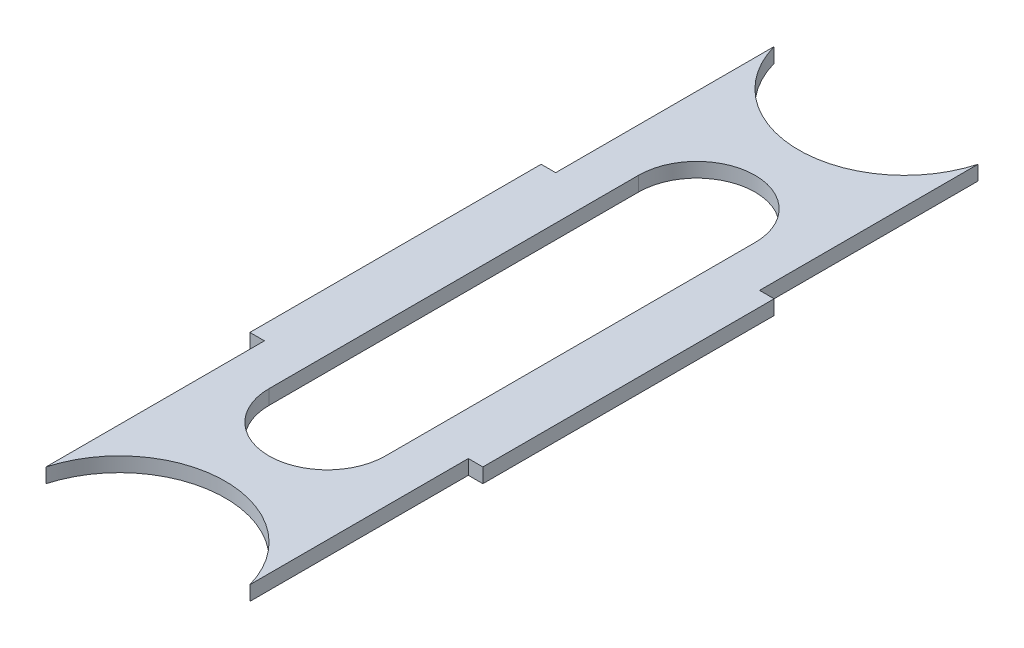
ISO-10303-21;
HEADER;
FILE_DESCRIPTION(('STEP AP214'),'2;1');
FILE_NAME('part.step','',(''),(''),'','','');
FILE_SCHEMA(('AUTOMOTIVE_DESIGN { 1 0 10303 214 1 1 1 1 }'));
ENDSEC;
DATA;
#1=APPLICATION_CONTEXT('core data for automotive mechanical design processes');
#2=APPLICATION_PROTOCOL_DEFINITION('international standard','automotive_design',2000,#1);
#3=PRODUCT_CONTEXT('',#1,'mechanical');
#4=PRODUCT('Part','Part','',(#3));
#5=PRODUCT_RELATED_PRODUCT_CATEGORY('part','',(#4));
#6=PRODUCT_DEFINITION_FORMATION('','',#4);
#7=PRODUCT_DEFINITION_CONTEXT('part definition',#1,'design');
#8=PRODUCT_DEFINITION('design','',#6,#7);
#9=PRODUCT_DEFINITION_SHAPE('','',#8);
#10=(LENGTH_UNIT() NAMED_UNIT(*) SI_UNIT(.MILLI.,.METRE.));
#11=(NAMED_UNIT(*) PLANE_ANGLE_UNIT() SI_UNIT($,.RADIAN.));
#12=(NAMED_UNIT(*) SI_UNIT($,.STERADIAN.) SOLID_ANGLE_UNIT());
#13=UNCERTAINTY_MEASURE_WITH_UNIT(LENGTH_MEASURE(1.E-05),#10,'distance_accuracy_value','');
#14=(GEOMETRIC_REPRESENTATION_CONTEXT(3) GLOBAL_UNCERTAINTY_ASSIGNED_CONTEXT((#13)) GLOBAL_UNIT_ASSIGNED_CONTEXT((#10,
#11,#12)) REPRESENTATION_CONTEXT('',''));
#15=CARTESIAN_POINT('',(0.,0.,0.));
#16=DIRECTION('',(0.,0.,1.));
#17=DIRECTION('',(1.,0.,0.));
#18=AXIS2_PLACEMENT_3D('',#15,#16,#17);
#19=CARTESIAN_POINT('',(0.,1.5875,-42.799));
#20=DIRECTION('',(0.,-1.,0.));
#21=DIRECTION('',(0.,0.,-1.));
#22=AXIS2_PLACEMENT_3D('',#19,#20,#21);
#23=CYLINDRICAL_SURFACE('',#22,11.5398911823292);
#24=CARTESIAN_POINT('',(0.,0.,-42.799));
#25=DIRECTION('',(0.,1.,0.));
#26=DIRECTION('',(0.,0.,1.));
#27=AXIS2_PLACEMENT_3D('',#24,#25,#26);
#28=CIRCLE('',#27,11.5398911823292);
#29=CARTESIAN_POINT('',(-11.1125,0.,-39.6875));
#30=VERTEX_POINT('',#29);
#31=CARTESIAN_POINT('',(11.1125,0.,-39.6875));
#32=VERTEX_POINT('',#31);
#33=EDGE_CURVE('E238',#30,#32,#28,.T.);
#34=ORIENTED_EDGE('',*,*,#33,.F.);
#35=DIRECTION('',(0.,-1.,0.));
#36=VECTOR('',#35,1.);
#37=CARTESIAN_POINT('',(-11.1125,1.5875,-39.6875));
#38=LINE('',#37,#36);
#39=CARTESIAN_POINT('',(-11.1125,1.5875,-39.6875));
#40=VERTEX_POINT('',#39);
#41=EDGE_CURVE('E11',#40,#30,#38,.T.);
#42=ORIENTED_EDGE('',*,*,#41,.F.);
#43=CARTESIAN_POINT('',(0.,1.5875,-42.799));
#44=DIRECTION('',(0.,1.,0.));
#45=DIRECTION('',(0.,0.,1.));
#46=AXIS2_PLACEMENT_3D('',#43,#44,#45);
#47=CIRCLE('',#46,11.5398911823292);
#48=CARTESIAN_POINT('',(11.1125,1.5875,-39.6875));
#49=VERTEX_POINT('',#48);
#50=EDGE_CURVE('E271',#40,#49,#47,.T.);
#51=ORIENTED_EDGE('',*,*,#50,.T.);
#52=DIRECTION('',(0.,-1.,0.));
#53=VECTOR('',#52,1.);
#54=CARTESIAN_POINT('',(11.1125,1.5875,-39.6875));
#55=LINE('',#54,#53);
#56=EDGE_CURVE('E58',#49,#32,#55,.T.);
#57=ORIENTED_EDGE('',*,*,#56,.T.);
#58=EDGE_LOOP('',(#34,#42,#51,#57));
#59=FACE_BOUND('',#58,.T.);
#60=ADVANCED_FACE('F39',(#59),#23,.F.);
#61=CARTESIAN_POINT('',(-11.1125,1.5875,0.));
#62=DIRECTION('',(1.,0.,0.));
#63=DIRECTION('',(0.,0.,-1.));
#64=AXIS2_PLACEMENT_3D('',#61,#62,#63);
#65=PLANE('',#64);
#66=DIRECTION('',(0.,0.,1.));
#67=VECTOR('',#66,1.);
#68=CARTESIAN_POINT('',(-11.1125,0.,0.));
#69=LINE('',#68,#67);
#70=CARTESIAN_POINT('',(-11.1125,0.,-15.875));
#71=VERTEX_POINT('',#70);
#72=EDGE_CURVE('E235',#30,#71,#69,.T.);
#73=ORIENTED_EDGE('',*,*,#72,.T.);
#74=DIRECTION('',(0.,-1.,0.));
#75=VECTOR('',#74,1.);
#76=CARTESIAN_POINT('',(-11.1125,1.5875,-15.875));
#77=LINE('',#76,#75);
#78=CARTESIAN_POINT('',(-11.1125,1.5875,-15.875));
#79=VERTEX_POINT('',#78);
#80=EDGE_CURVE('E49',#79,#71,#77,.T.);
#81=ORIENTED_EDGE('',*,*,#80,.F.);
#82=DIRECTION('',(0.,0.,1.));
#83=VECTOR('',#82,1.);
#84=CARTESIAN_POINT('',(-11.1125,1.5875,0.));
#85=LINE('',#84,#83);
#86=EDGE_CURVE('E269',#40,#79,#85,.T.);
#87=ORIENTED_EDGE('',*,*,#86,.F.);
#88=ORIENTED_EDGE('',*,*,#41,.T.);
#89=EDGE_LOOP('',(#73,#81,#87,#88));
#90=FACE_BOUND('',#89,.T.);
#91=ADVANCED_FACE('F305',(#90),#65,.F.);
#92=CARTESIAN_POINT('',(0.,1.5875,-15.875));
#93=DIRECTION('',(0.,0.,-1.));
#94=DIRECTION('',(-1.,0.,0.));
#95=AXIS2_PLACEMENT_3D('',#92,#93,#94);
#96=PLANE('',#95);
#97=DIRECTION('',(1.,0.,0.));
#98=VECTOR('',#97,1.);
#99=CARTESIAN_POINT('',(0.,0.,-15.875));
#100=LINE('',#99,#98);
#101=CARTESIAN_POINT('',(-12.7,0.,-15.875));
#102=VERTEX_POINT('',#101);
#103=EDGE_CURVE('E232',#102,#71,#100,.T.);
#104=ORIENTED_EDGE('',*,*,#103,.F.);
#105=DIRECTION('',(0.,-1.,0.));
#106=VECTOR('',#105,1.);
#107=CARTESIAN_POINT('',(-12.7,1.5875,-15.875));
#108=LINE('',#107,#106);
#109=CARTESIAN_POINT('',(-12.7,1.5875,-15.875));
#110=VERTEX_POINT('',#109);
#111=EDGE_CURVE('E198',#110,#102,#108,.T.);
#112=ORIENTED_EDGE('',*,*,#111,.F.);
#113=DIRECTION('',(1.,0.,0.));
#114=VECTOR('',#113,1.);
#115=CARTESIAN_POINT('',(0.,1.5875,-15.875));
#116=LINE('',#115,#114);
#117=EDGE_CURVE('E266',#110,#79,#116,.T.);
#118=ORIENTED_EDGE('',*,*,#117,.T.);
#119=ORIENTED_EDGE('',*,*,#80,.T.);
#120=EDGE_LOOP('',(#104,#112,#118,#119));
#121=FACE_BOUND('',#120,.T.);
#122=ADVANCED_FACE('F310',(#121),#96,.T.);
#123=CARTESIAN_POINT('',(-12.7,1.5875,0.));
#124=DIRECTION('',(-1.,0.,0.));
#125=DIRECTION('',(0.,0.,1.));
#126=AXIS2_PLACEMENT_3D('',#123,#124,#125);
#127=PLANE('',#126);
#128=DIRECTION('',(0.,0.,-1.));
#129=VECTOR('',#128,1.);
#130=CARTESIAN_POINT('',(-12.7,0.,0.));
#131=LINE('',#130,#129);
#132=CARTESIAN_POINT('',(-12.7,0.,15.875));
#133=VERTEX_POINT('',#132);
#134=EDGE_CURVE('E229',#133,#102,#131,.T.);
#135=ORIENTED_EDGE('',*,*,#134,.F.);
#136=DIRECTION('',(0.,-1.,0.));
#137=VECTOR('',#136,1.);
#138=CARTESIAN_POINT('',(-12.7,1.5875,15.875));
#139=LINE('',#138,#137);
#140=CARTESIAN_POINT('',(-12.7,1.5875,15.875));
#141=VERTEX_POINT('',#140);
#142=EDGE_CURVE('E196',#141,#133,#139,.T.);
#143=ORIENTED_EDGE('',*,*,#142,.F.);
#144=DIRECTION('',(0.,0.,-1.));
#145=VECTOR('',#144,1.);
#146=CARTESIAN_POINT('',(-12.7,1.5875,0.));
#147=LINE('',#146,#145);
#148=EDGE_CURVE('E263',#141,#110,#147,.T.);
#149=ORIENTED_EDGE('',*,*,#148,.T.);
#150=ORIENTED_EDGE('',*,*,#111,.T.);
#151=EDGE_LOOP('',(#135,#143,#149,#150));
#152=FACE_BOUND('',#151,.T.);
#153=ADVANCED_FACE('F422',(#152),#127,.T.);
#154=CARTESIAN_POINT('',(0.,1.5875,15.875));
#155=DIRECTION('',(0.,0.,1.));
#156=DIRECTION('',(1.,0.,0.));
#157=AXIS2_PLACEMENT_3D('',#154,#155,#156);
#158=PLANE('',#157);
#159=DIRECTION('',(-1.,0.,0.));
#160=VECTOR('',#159,1.);
#161=CARTESIAN_POINT('',(0.,0.,15.875));
#162=LINE('',#161,#160);
#163=CARTESIAN_POINT('',(-11.1125,0.,15.875));
#164=VERTEX_POINT('',#163);
#165=EDGE_CURVE('E226',#164,#133,#162,.T.);
#166=ORIENTED_EDGE('',*,*,#165,.F.);
#167=DIRECTION('',(0.,-1.,0.));
#168=VECTOR('',#167,1.);
#169=CARTESIAN_POINT('',(-11.1125,1.5875,15.875));
#170=LINE('',#169,#168);
#171=CARTESIAN_POINT('',(-11.1125,1.5875,15.875));
#172=VERTEX_POINT('',#171);
#173=EDGE_CURVE('E194',#172,#164,#170,.T.);
#174=ORIENTED_EDGE('',*,*,#173,.F.);
#175=DIRECTION('',(-1.,0.,0.));
#176=VECTOR('',#175,1.);
#177=CARTESIAN_POINT('',(0.,1.5875,15.875));
#178=LINE('',#177,#176);
#179=EDGE_CURVE('E260',#172,#141,#178,.T.);
#180=ORIENTED_EDGE('',*,*,#179,.T.);
#181=ORIENTED_EDGE('',*,*,#142,.T.);
#182=EDGE_LOOP('',(#166,#174,#180,#181));
#183=FACE_BOUND('',#182,.T.);
#184=ADVANCED_FACE('F413',(#183),#158,.T.);
#185=CARTESIAN_POINT('',(-11.1125,0.,39.6875));
#186=VERTEX_POINT('',#185);
#187=EDGE_CURVE('E225',#164,#186,#69,.T.);
#188=ORIENTED_EDGE('',*,*,#187,.T.);
#189=DIRECTION('',(0.,-1.,0.));
#190=VECTOR('',#189,1.);
#191=CARTESIAN_POINT('',(-11.1125,1.5875,39.6875));
#192=LINE('',#191,#190);
#193=CARTESIAN_POINT('',(-11.1125,1.5875,39.6875));
#194=VERTEX_POINT('',#193);
#195=EDGE_CURVE('E192',#194,#186,#192,.T.);
#196=ORIENTED_EDGE('',*,*,#195,.F.);
#197=EDGE_CURVE('E259',#172,#194,#85,.T.);
#198=ORIENTED_EDGE('',*,*,#197,.F.);
#199=ORIENTED_EDGE('',*,*,#173,.T.);
#200=EDGE_LOOP('',(#188,#196,#198,#199));
#201=FACE_BOUND('',#200,.T.);
#202=ADVANCED_FACE('F313',(#201),#65,.F.);
#203=CARTESIAN_POINT('',(0.,1.5875,42.799));
#204=DIRECTION('',(0.,-1.,0.));
#205=DIRECTION('',(0.,0.,-1.));
#206=AXIS2_PLACEMENT_3D('',#203,#204,#205);
#207=CYLINDRICAL_SURFACE('',#206,11.5398911823292);
#208=CARTESIAN_POINT('',(0.,0.,42.799));
#209=DIRECTION('',(0.,1.,0.));
#210=DIRECTION('',(0.,0.,1.));
#211=AXIS2_PLACEMENT_3D('',#208,#209,#210);
#212=CIRCLE('',#211,11.5398911823292);
#213=CARTESIAN_POINT('',(11.1125,0.,39.6875));
#214=VERTEX_POINT('',#213);
#215=EDGE_CURVE('E222',#214,#186,#212,.T.);
#216=ORIENTED_EDGE('',*,*,#215,.F.);
#217=DIRECTION('',(0.,-1.,0.));
#218=VECTOR('',#217,1.);
#219=CARTESIAN_POINT('',(11.1125,1.5875,39.6875));
#220=LINE('',#219,#218);
#221=CARTESIAN_POINT('',(11.1125,1.5875,39.6875));
#222=VERTEX_POINT('',#221);
#223=EDGE_CURVE('E190',#222,#214,#220,.T.);
#224=ORIENTED_EDGE('',*,*,#223,.F.);
#225=CARTESIAN_POINT('',(0.,1.5875,42.799));
#226=DIRECTION('',(0.,1.,0.));
#227=DIRECTION('',(0.,0.,1.));
#228=AXIS2_PLACEMENT_3D('',#225,#226,#227);
#229=CIRCLE('',#228,11.5398911823292);
#230=EDGE_CURVE('E256',#222,#194,#229,.T.);
#231=ORIENTED_EDGE('',*,*,#230,.T.);
#232=ORIENTED_EDGE('',*,*,#195,.T.);
#233=EDGE_LOOP('',(#216,#224,#231,#232));
#234=FACE_BOUND('',#233,.T.);
#235=ADVANCED_FACE('F302',(#234),#207,.F.);
#236=CARTESIAN_POINT('',(11.1125,1.5875,0.));
#237=DIRECTION('',(1.,0.,0.));
#238=DIRECTION('',(0.,0.,-1.));
#239=AXIS2_PLACEMENT_3D('',#236,#237,#238);
#240=PLANE('',#239);
#241=DIRECTION('',(0.,0.,1.));
#242=VECTOR('',#241,1.);
#243=CARTESIAN_POINT('',(11.1125,0.,0.));
#244=LINE('',#243,#242);
#245=CARTESIAN_POINT('',(11.1125,0.,15.875));
#246=VERTEX_POINT('',#245);
#247=EDGE_CURVE('E219',#246,#214,#244,.T.);
#248=ORIENTED_EDGE('',*,*,#247,.F.);
#249=DIRECTION('',(0.,-1.,0.));
#250=VECTOR('',#249,1.);
#251=CARTESIAN_POINT('',(11.1125,1.5875,15.875));
#252=LINE('',#251,#250);
#253=CARTESIAN_POINT('',(11.1125,1.5875,15.875));
#254=VERTEX_POINT('',#253);
#255=EDGE_CURVE('E184',#254,#246,#252,.T.);
#256=ORIENTED_EDGE('',*,*,#255,.F.);
#257=DIRECTION('',(0.,0.,1.));
#258=VECTOR('',#257,1.);
#259=CARTESIAN_POINT('',(11.1125,1.5875,0.));
#260=LINE('',#259,#258);
#261=EDGE_CURVE('E253',#254,#222,#260,.T.);
#262=ORIENTED_EDGE('',*,*,#261,.T.);
#263=ORIENTED_EDGE('',*,*,#223,.T.);
#264=EDGE_LOOP('',(#248,#256,#262,#263));
#265=FACE_BOUND('',#264,.T.);
#266=ADVANCED_FACE('F288',(#265),#240,.T.);
#267=CARTESIAN_POINT('',(0.,1.5875,15.875));
#268=DIRECTION('',(0.,0.,-1.));
#269=DIRECTION('',(-1.,0.,0.));
#270=AXIS2_PLACEMENT_3D('',#267,#268,#269);
#271=PLANE('',#270);
#272=DIRECTION('',(1.,0.,0.));
#273=VECTOR('',#272,1.);
#274=CARTESIAN_POINT('',(0.,0.,15.875));
#275=LINE('',#274,#273);
#276=CARTESIAN_POINT('',(12.7,0.,15.875));
#277=VERTEX_POINT('',#276);
#278=EDGE_CURVE('E216',#246,#277,#275,.T.);
#279=ORIENTED_EDGE('',*,*,#278,.T.);
#280=DIRECTION('',(0.,-1.,0.));
#281=VECTOR('',#280,1.);
#282=CARTESIAN_POINT('',(12.7,1.5875,15.875));
#283=LINE('',#282,#281);
#284=CARTESIAN_POINT('',(12.7,1.5875,15.875));
#285=VERTEX_POINT('',#284);
#286=EDGE_CURVE('E182',#285,#277,#283,.T.);
#287=ORIENTED_EDGE('',*,*,#286,.F.);
#288=DIRECTION('',(1.,0.,0.));
#289=VECTOR('',#288,1.);
#290=CARTESIAN_POINT('',(0.,1.5875,15.875));
#291=LINE('',#290,#289);
#292=EDGE_CURVE('E175',#254,#285,#291,.T.);
#293=ORIENTED_EDGE('',*,*,#292,.F.);
#294=ORIENTED_EDGE('',*,*,#255,.T.);
#295=EDGE_LOOP('',(#279,#287,#293,#294));
#296=FACE_BOUND('',#295,.T.);
#297=ADVANCED_FACE('F301',(#296),#271,.F.);
#298=CARTESIAN_POINT('',(12.7,1.5875,0.));
#299=DIRECTION('',(-1.,0.,0.));
#300=DIRECTION('',(0.,0.,1.));
#301=AXIS2_PLACEMENT_3D('',#298,#299,#300);
#302=PLANE('',#301);
#303=DIRECTION('',(0.,0.,-1.));
#304=VECTOR('',#303,1.);
#305=CARTESIAN_POINT('',(12.7,0.,0.));
#306=LINE('',#305,#304);
#307=CARTESIAN_POINT('',(12.7,0.,-15.875));
#308=VERTEX_POINT('',#307);
#309=EDGE_CURVE('E181',#277,#308,#306,.T.);
#310=ORIENTED_EDGE('',*,*,#309,.T.);
#311=DIRECTION('',(0.,-1.,0.));
#312=VECTOR('',#311,1.);
#313=CARTESIAN_POINT('',(12.7,1.5875,-15.875));
#314=LINE('',#313,#312);
#315=CARTESIAN_POINT('',(12.7,1.5875,-15.875));
#316=VERTEX_POINT('',#315);
#317=EDGE_CURVE('E163',#316,#308,#314,.T.);
#318=ORIENTED_EDGE('',*,*,#317,.F.);
#319=DIRECTION('',(0.,0.,-1.));
#320=VECTOR('',#319,1.);
#321=CARTESIAN_POINT('',(12.7,1.5875,0.));
#322=LINE('',#321,#320);
#323=EDGE_CURVE('E168',#285,#316,#322,.T.);
#324=ORIENTED_EDGE('',*,*,#323,.F.);
#325=ORIENTED_EDGE('',*,*,#286,.T.);
#326=EDGE_LOOP('',(#310,#318,#324,#325));
#327=FACE_BOUND('',#326,.T.);
#328=ADVANCED_FACE('F180',(#327),#302,.F.);
#329=CARTESIAN_POINT('',(0.,1.5875,-15.875));
#330=DIRECTION('',(0.,0.,1.));
#331=DIRECTION('',(1.,0.,0.));
#332=AXIS2_PLACEMENT_3D('',#329,#330,#331);
#333=PLANE('',#332);
#334=DIRECTION('',(-1.,0.,0.));
#335=VECTOR('',#334,1.);
#336=CARTESIAN_POINT('',(0.,0.,-15.875));
#337=LINE('',#336,#335);
#338=CARTESIAN_POINT('',(11.1125,0.,-15.875));
#339=VERTEX_POINT('',#338);
#340=EDGE_CURVE('E212',#308,#339,#337,.T.);
#341=ORIENTED_EDGE('',*,*,#340,.T.);
#342=DIRECTION('',(0.,-1.,0.));
#343=VECTOR('',#342,1.);
#344=CARTESIAN_POINT('',(11.1125,1.5875,-15.875));
#345=LINE('',#344,#343);
#346=CARTESIAN_POINT('',(11.1125,1.5875,-15.875));
#347=VERTEX_POINT('',#346);
#348=EDGE_CURVE('E108',#347,#339,#345,.T.);
#349=ORIENTED_EDGE('',*,*,#348,.F.);
#350=DIRECTION('',(-1.,0.,0.));
#351=VECTOR('',#350,1.);
#352=CARTESIAN_POINT('',(0.,1.5875,-15.875));
#353=LINE('',#352,#351);
#354=EDGE_CURVE('E159',#316,#347,#353,.T.);
#355=ORIENTED_EDGE('',*,*,#354,.F.);
#356=ORIENTED_EDGE('',*,*,#317,.T.);
#357=EDGE_LOOP('',(#341,#349,#355,#356));
#358=FACE_BOUND('',#357,.T.);
#359=ADVANCED_FACE('F161',(#358),#333,.F.);
#360=CARTESIAN_POINT('',(0.,1.5875,20.1466088176708));
#361=DIRECTION('',(0.,-1.,0.));
#362=DIRECTION('',(0.,0.,-1.));
#363=AXIS2_PLACEMENT_3D('',#360,#361,#362);
#364=CYLINDRICAL_SURFACE('',#363,6.35);
#365=CARTESIAN_POINT('',(0.,0.,20.1466088176708));
#366=DIRECTION('',(0.,1.,0.));
#367=DIRECTION('',(0.,0.,1.));
#368=AXIS2_PLACEMENT_3D('',#365,#366,#367);
#369=CIRCLE('',#368,6.35);
#370=CARTESIAN_POINT('',(-6.35,0.,20.1466088176708));
#371=VERTEX_POINT('',#370);
#372=CARTESIAN_POINT('',(6.35,0.,20.1466088176708));
#373=VERTEX_POINT('',#372);
#374=EDGE_CURVE('E249',#371,#373,#369,.T.);
#375=ORIENTED_EDGE('',*,*,#374,.F.);
#376=DIRECTION('',(0.,-1.,0.));
#377=VECTOR('',#376,1.);
#378=CARTESIAN_POINT('',(-6.35,1.5875,20.1466088176708));
#379=LINE('',#378,#377);
#380=CARTESIAN_POINT('',(-6.35,1.5875,20.1466088176708));
#381=VERTEX_POINT('',#380);
#382=EDGE_CURVE('E43',#381,#371,#379,.T.);
#383=ORIENTED_EDGE('',*,*,#382,.F.);
#384=CARTESIAN_POINT('',(0.,1.5875,20.1466088176708));
#385=DIRECTION('',(0.,1.,0.));
#386=DIRECTION('',(0.,0.,1.));
#387=AXIS2_PLACEMENT_3D('',#384,#385,#386);
#388=CIRCLE('',#387,6.35);
#389=CARTESIAN_POINT('',(6.35,1.5875,20.1466088176708));
#390=VERTEX_POINT('',#389);
#391=EDGE_CURVE('E279',#381,#390,#388,.T.);
#392=ORIENTED_EDGE('',*,*,#391,.T.);
#393=DIRECTION('',(0.,-1.,0.));
#394=VECTOR('',#393,1.);
#395=CARTESIAN_POINT('',(6.35,1.5875,20.1466088176708));
#396=LINE('',#395,#394);
#397=EDGE_CURVE('E201',#390,#373,#396,.T.);
#398=ORIENTED_EDGE('',*,*,#397,.T.);
#399=EDGE_LOOP('',(#375,#383,#392,#398));
#400=FACE_BOUND('',#399,.T.);
#401=ADVANCED_FACE('F41',(#400),#364,.F.);
#402=CARTESIAN_POINT('',(-6.35,1.5875,0.));
#403=DIRECTION('',(1.,0.,0.));
#404=DIRECTION('',(0.,0.,-1.));
#405=AXIS2_PLACEMENT_3D('',#402,#403,#404);
#406=PLANE('',#405);
#407=DIRECTION('',(0.,0.,1.));
#408=VECTOR('',#407,1.);
#409=CARTESIAN_POINT('',(-6.35,0.,0.));
#410=LINE('',#409,#408);
#411=CARTESIAN_POINT('',(-6.35,0.,-20.1466088176708));
#412=VERTEX_POINT('',#411);
#413=EDGE_CURVE('E246',#412,#371,#410,.T.);
#414=ORIENTED_EDGE('',*,*,#413,.F.);
#415=DIRECTION('',(0.,-1.,0.));
#416=VECTOR('',#415,1.);
#417=CARTESIAN_POINT('',(-6.35,1.5875,-20.1466088176708));
#418=LINE('',#417,#416);
#419=CARTESIAN_POINT('',(-6.35,1.5875,-20.1466088176708));
#420=VERTEX_POINT('',#419);
#421=EDGE_CURVE('E204',#420,#412,#418,.T.);
#422=ORIENTED_EDGE('',*,*,#421,.F.);
#423=DIRECTION('',(0.,0.,1.));
#424=VECTOR('',#423,1.);
#425=CARTESIAN_POINT('',(-6.35,1.5875,0.));
#426=LINE('',#425,#424);
#427=EDGE_CURVE('E277',#420,#381,#426,.T.);
#428=ORIENTED_EDGE('',*,*,#427,.T.);
#429=ORIENTED_EDGE('',*,*,#382,.T.);
#430=EDGE_LOOP('',(#414,#422,#428,#429));
#431=FACE_BOUND('',#430,.T.);
#432=ADVANCED_FACE('F318',(#431),#406,.T.);
#433=CARTESIAN_POINT('',(0.,1.5875,-20.1466088176708));
#434=DIRECTION('',(0.,-1.,0.));
#435=DIRECTION('',(0.,0.,-1.));
#436=AXIS2_PLACEMENT_3D('',#433,#434,#435);
#437=CYLINDRICAL_SURFACE('',#436,6.35);
#438=CARTESIAN_POINT('',(0.,0.,-20.1466088176708));
#439=DIRECTION('',(0.,1.,0.));
#440=DIRECTION('',(0.,0.,1.));
#441=AXIS2_PLACEMENT_3D('',#438,#439,#440);
#442=CIRCLE('',#441,6.35);
#443=CARTESIAN_POINT('',(6.35,0.,-20.1466088176708));
#444=VERTEX_POINT('',#443);
#445=EDGE_CURVE('E243',#444,#412,#442,.T.);
#446=ORIENTED_EDGE('',*,*,#445,.F.);
#447=DIRECTION('',(0.,-1.,0.));
#448=VECTOR('',#447,1.);
#449=CARTESIAN_POINT('',(6.35,1.5875,-20.1466088176708));
#450=LINE('',#449,#448);
#451=CARTESIAN_POINT('',(6.35,1.5875,-20.1466088176708));
#452=VERTEX_POINT('',#451);
#453=EDGE_CURVE('E203',#452,#444,#450,.T.);
#454=ORIENTED_EDGE('',*,*,#453,.F.);
#455=CARTESIAN_POINT('',(0.,1.5875,-20.1466088176708));
#456=DIRECTION('',(0.,1.,0.));
#457=DIRECTION('',(0.,0.,1.));
#458=AXIS2_PLACEMENT_3D('',#455,#456,#457);
#459=CIRCLE('',#458,6.35);
#460=EDGE_CURVE('E275',#452,#420,#459,.T.);
#461=ORIENTED_EDGE('',*,*,#460,.T.);
#462=ORIENTED_EDGE('',*,*,#421,.T.);
#463=EDGE_LOOP('',(#446,#454,#461,#462));
#464=FACE_BOUND('',#463,.T.);
#465=ADVANCED_FACE('F295',(#464),#437,.F.);
#466=CARTESIAN_POINT('',(6.35,1.5875,0.));
#467=DIRECTION('',(1.,0.,0.));
#468=DIRECTION('',(0.,0.,-1.));
#469=AXIS2_PLACEMENT_3D('',#466,#467,#468);
#470=PLANE('',#469);
#471=DIRECTION('',(0.,0.,1.));
#472=VECTOR('',#471,1.);
#473=CARTESIAN_POINT('',(6.35,0.,0.));
#474=LINE('',#473,#472);
#475=EDGE_CURVE('E240',#444,#373,#474,.T.);
#476=ORIENTED_EDGE('',*,*,#475,.T.);
#477=ORIENTED_EDGE('',*,*,#397,.F.);
#478=DIRECTION('',(0.,0.,1.));
#479=VECTOR('',#478,1.);
#480=CARTESIAN_POINT('',(6.35,1.5875,0.));
#481=LINE('',#480,#479);
#482=EDGE_CURVE('E273',#452,#390,#481,.T.);
#483=ORIENTED_EDGE('',*,*,#482,.F.);
#484=ORIENTED_EDGE('',*,*,#453,.T.);
#485=EDGE_LOOP('',(#476,#477,#483,#484));
#486=FACE_BOUND('',#485,.T.);
#487=ADVANCED_FACE('F286',(#486),#470,.F.);
#488=EDGE_CURVE('E214',#32,#339,#244,.T.);
#489=ORIENTED_EDGE('',*,*,#488,.F.);
#490=ORIENTED_EDGE('',*,*,#56,.F.);
#491=EDGE_CURVE('E167',#49,#347,#260,.T.);
#492=ORIENTED_EDGE('',*,*,#491,.T.);
#493=ORIENTED_EDGE('',*,*,#348,.T.);
#494=EDGE_LOOP('',(#489,#490,#492,#493));
#495=FACE_BOUND('',#494,.T.);
#496=ADVANCED_FACE('F284',(#495),#240,.T.);
#497=CARTESIAN_POINT('',(0.,1.5875,0.));
#498=DIRECTION('',(0.,1.,0.));
#499=DIRECTION('',(0.,0.,1.));
#500=AXIS2_PLACEMENT_3D('',#497,#498,#499);
#501=PLANE('',#500);
#502=ORIENTED_EDGE('',*,*,#391,.F.);
#503=ORIENTED_EDGE('',*,*,#427,.F.);
#504=ORIENTED_EDGE('',*,*,#460,.F.);
#505=ORIENTED_EDGE('',*,*,#482,.T.);
#506=EDGE_LOOP('',(#502,#503,#504,#505));
#507=FACE_BOUND('',#506,.T.);
#508=ORIENTED_EDGE('',*,*,#50,.F.);
#509=ORIENTED_EDGE('',*,*,#86,.T.);
#510=ORIENTED_EDGE('',*,*,#117,.F.);
#511=ORIENTED_EDGE('',*,*,#148,.F.);
#512=ORIENTED_EDGE('',*,*,#179,.F.);
#513=ORIENTED_EDGE('',*,*,#197,.T.);
#514=ORIENTED_EDGE('',*,*,#230,.F.);
#515=ORIENTED_EDGE('',*,*,#261,.F.);
#516=ORIENTED_EDGE('',*,*,#292,.T.);
#517=ORIENTED_EDGE('',*,*,#323,.T.);
#518=ORIENTED_EDGE('',*,*,#354,.T.);
#519=ORIENTED_EDGE('',*,*,#491,.F.);
#520=EDGE_LOOP('',(#508,#509,#510,#511,#512,#513,#514,#515,#516,#517,#518,#519));
#521=FACE_BOUND('',#520,.T.);
#522=ADVANCED_FACE('F172',(#507,#521),#501,.T.);
#523=CARTESIAN_POINT('',(0.,0.,0.));
#524=DIRECTION('',(0.,1.,0.));
#525=DIRECTION('',(0.,0.,1.));
#526=AXIS2_PLACEMENT_3D('',#523,#524,#525);
#527=PLANE('',#526);
#528=ORIENTED_EDGE('',*,*,#374,.T.);
#529=ORIENTED_EDGE('',*,*,#475,.F.);
#530=ORIENTED_EDGE('',*,*,#445,.T.);
#531=ORIENTED_EDGE('',*,*,#413,.T.);
#532=EDGE_LOOP('',(#528,#529,#530,#531));
#533=FACE_BOUND('',#532,.T.);
#534=ORIENTED_EDGE('',*,*,#33,.T.);
#535=ORIENTED_EDGE('',*,*,#488,.T.);
#536=ORIENTED_EDGE('',*,*,#340,.F.);
#537=ORIENTED_EDGE('',*,*,#309,.F.);
#538=ORIENTED_EDGE('',*,*,#278,.F.);
#539=ORIENTED_EDGE('',*,*,#247,.T.);
#540=ORIENTED_EDGE('',*,*,#215,.T.);
#541=ORIENTED_EDGE('',*,*,#187,.F.);
#542=ORIENTED_EDGE('',*,*,#165,.T.);
#543=ORIENTED_EDGE('',*,*,#134,.T.);
#544=ORIENTED_EDGE('',*,*,#103,.T.);
#545=ORIENTED_EDGE('',*,*,#72,.F.);
#546=EDGE_LOOP('',(#534,#535,#536,#537,#538,#539,#540,#541,#542,#543,#544,#545));
#547=FACE_BOUND('',#546,.T.);
#548=ADVANCED_FACE('F282',(#533,#547),#527,.F.);
#549=CLOSED_SHELL('',(#60,#91,#122,#153,#184,#202,#235,#266,#297,#328,#359,#401,#432,#465,#487,
#496,#522,#548));
#550=MANIFOLD_SOLID_BREP('B2',#549);
#551=ADVANCED_BREP_SHAPE_REPRESENTATION('',(#18,#550),#14);
#552=SHAPE_DEFINITION_REPRESENTATION(#9,#551);
ENDSEC;
END-ISO-10303-21;
